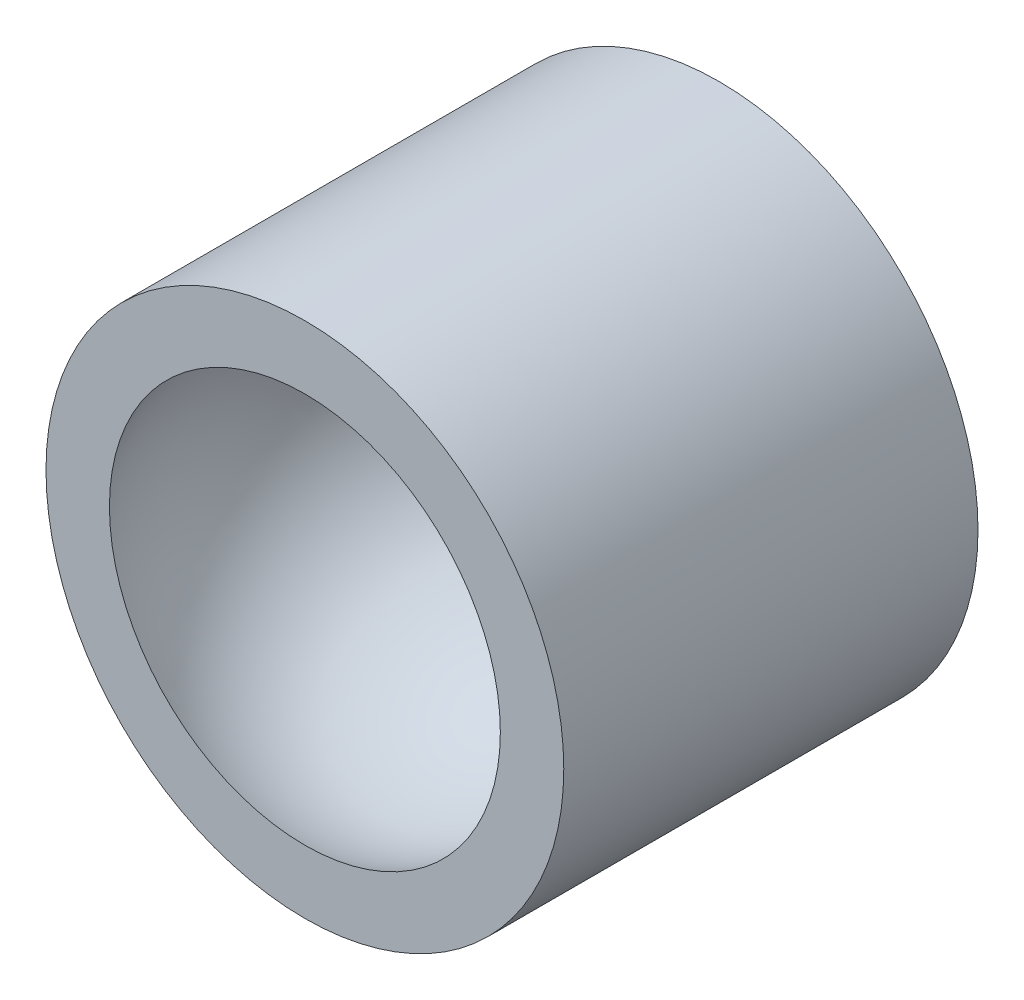
ISO-10303-21;
HEADER;
FILE_DESCRIPTION(('STEP AP214'),'2;1');
FILE_NAME('part.step','',(''),(''),'','','');
FILE_SCHEMA(('AUTOMOTIVE_DESIGN { 1 0 10303 214 1 1 1 1 }'));
ENDSEC;
DATA;
#1=APPLICATION_CONTEXT('core data for automotive mechanical design processes');
#2=APPLICATION_PROTOCOL_DEFINITION('international standard','automotive_design',2000,#1);
#3=PRODUCT_CONTEXT('',#1,'mechanical');
#4=PRODUCT('Part','Part','',(#3));
#5=PRODUCT_RELATED_PRODUCT_CATEGORY('part','',(#4));
#6=PRODUCT_DEFINITION_FORMATION('','',#4);
#7=PRODUCT_DEFINITION_CONTEXT('part definition',#1,'design');
#8=PRODUCT_DEFINITION('design','',#6,#7);
#9=PRODUCT_DEFINITION_SHAPE('','',#8);
#10=(LENGTH_UNIT() NAMED_UNIT(*) SI_UNIT(.MILLI.,.METRE.));
#11=(NAMED_UNIT(*) PLANE_ANGLE_UNIT() SI_UNIT($,.RADIAN.));
#12=(NAMED_UNIT(*) SI_UNIT($,.STERADIAN.) SOLID_ANGLE_UNIT());
#13=UNCERTAINTY_MEASURE_WITH_UNIT(LENGTH_MEASURE(1.E-05),#10,'distance_accuracy_value','');
#14=(GEOMETRIC_REPRESENTATION_CONTEXT(3) GLOBAL_UNCERTAINTY_ASSIGNED_CONTEXT((#13)) GLOBAL_UNIT_ASSIGNED_CONTEXT((#10,
#11,#12)) REPRESENTATION_CONTEXT('',''));
#15=CARTESIAN_POINT('',(0.,0.,0.));
#16=DIRECTION('',(0.,0.,1.));
#17=DIRECTION('',(1.,0.,0.));
#18=AXIS2_PLACEMENT_3D('',#15,#16,#17);
#19=CARTESIAN_POINT('',(0.,0.,35.));
#20=DIRECTION('',(0.,0.,-1.));
#21=DIRECTION('',(-1.,0.,0.));
#22=AXIS2_PLACEMENT_3D('',#19,#20,#21);
#23=CYLINDRICAL_SURFACE('',#22,12.5);
#24=CARTESIAN_POINT('',(0.,0.,35.));
#25=DIRECTION('',(0.,0.,1.));
#26=DIRECTION('',(1.,0.,0.));
#27=AXIS2_PLACEMENT_3D('',#24,#25,#26);
#28=CIRCLE('',#27,12.5);
#29=CARTESIAN_POINT('',(12.5,0.,35.));
#30=VERTEX_POINT('',#29);
#31=EDGE_CURVE('E10',#30,#30,#28,.T.);
#32=ORIENTED_EDGE('',*,*,#31,.F.);
#33=EDGE_LOOP('',(#32));
#34=FACE_BOUND('',#33,.T.);
#35=CARTESIAN_POINT('',(0.,0.,15.));
#36=DIRECTION('',(0.,0.,-1.));
#37=DIRECTION('',(-1.,0.,0.));
#38=AXIS2_PLACEMENT_3D('',#35,#36,#37);
#39=CIRCLE('',#38,12.5);
#40=CARTESIAN_POINT('',(-12.5,0.,15.));
#41=VERTEX_POINT('',#40);
#42=EDGE_CURVE('E38',#41,#41,#39,.T.);
#43=ORIENTED_EDGE('',*,*,#42,.F.);
#44=EDGE_LOOP('',(#43));
#45=FACE_BOUND('',#44,.T.);
#46=ADVANCED_FACE('F31',(#34,#45),#23,.T.);
#47=CARTESIAN_POINT('',(0.,0.,35.));
#48=DIRECTION('',(0.,0.,1.));
#49=DIRECTION('',(1.,0.,0.));
#50=AXIS2_PLACEMENT_3D('',#47,#48,#49);
#51=PLANE('',#50);
#52=CARTESIAN_POINT('',(0.,0.,35.));
#53=DIRECTION('',(0.,0.,1.));
#54=DIRECTION('',(1.,0.,0.));
#55=AXIS2_PLACEMENT_3D('',#52,#53,#54);
#56=CIRCLE('',#55,9.43729304408843);
#57=CARTESIAN_POINT('',(9.43729304408843,0.,35.));
#58=VERTEX_POINT('',#57);
#59=EDGE_CURVE('E34',#58,#58,#56,.F.);
#60=ORIENTED_EDGE('',*,*,#59,.T.);
#61=EDGE_LOOP('',(#60));
#62=FACE_BOUND('',#61,.T.);
#63=ORIENTED_EDGE('',*,*,#31,.T.);
#64=EDGE_LOOP('',(#63));
#65=FACE_BOUND('',#64,.T.);
#66=ADVANCED_FACE('F48',(#62,#65),#51,.T.);
#67=CARTESIAN_POINT('',(0.,0.,15.));
#68=DIRECTION('',(0.,0.,-1.));
#69=DIRECTION('',(-1.,0.,0.));
#70=AXIS2_PLACEMENT_3D('',#67,#68,#69);
#71=PLANE('',#70);
#72=ORIENTED_EDGE('',*,*,#42,.T.);
#73=EDGE_LOOP('',(#72));
#74=FACE_BOUND('',#73,.T.);
#75=ADVANCED_FACE('F52',(#74),#71,.T.);
#76=CARTESIAN_POINT('',(0.,0.,31.));
#77=DIRECTION('',(0.,0.,1.));
#78=DIRECTION('',(-1.,0.,0.));
#79=AXIS2_PLACEMENT_3D('',#76,#77,#78);
#80=SPHERICAL_SURFACE('',#79,10.25);
#81=ORIENTED_EDGE('',*,*,#59,.F.);
#82=EDGE_LOOP('',(#81));
#83=FACE_BOUND('',#82,.T.);
#84=ADVANCED_FACE('F50',(#83),#80,.F.);
#85=CLOSED_SHELL('',(#46,#66,#75,#84));
#86=MANIFOLD_SOLID_BREP('B2',#85);
#87=ADVANCED_BREP_SHAPE_REPRESENTATION('',(#18,#86),#14);
#88=SHAPE_DEFINITION_REPRESENTATION(#9,#87);
ENDSEC;
END-ISO-10303-21;
